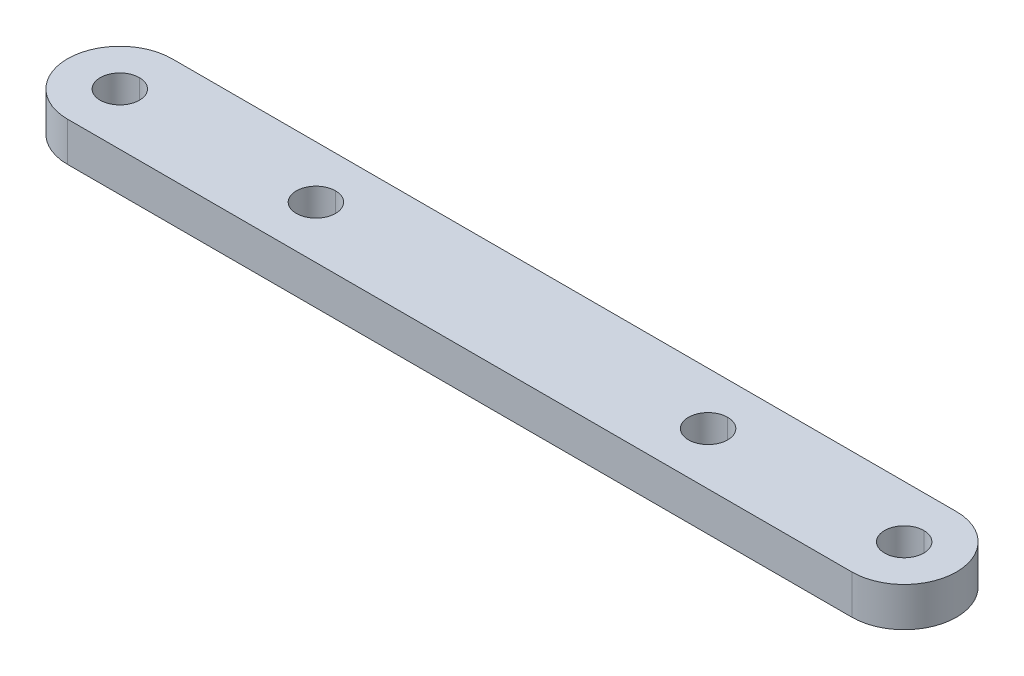
ISO-10303-21;
HEADER;
FILE_DESCRIPTION(('STEP AP214'),'2;1');
FILE_NAME('part.step','',(''),(''),'','','');
FILE_SCHEMA(('AUTOMOTIVE_DESIGN { 1 0 10303 214 1 1 1 1 }'));
ENDSEC;
DATA;
#1=APPLICATION_CONTEXT('core data for automotive mechanical design processes');
#2=APPLICATION_PROTOCOL_DEFINITION('international standard','automotive_design',2000,#1);
#3=PRODUCT_CONTEXT('',#1,'mechanical');
#4=PRODUCT('Part','Part','',(#3));
#5=PRODUCT_RELATED_PRODUCT_CATEGORY('part','',(#4));
#6=PRODUCT_DEFINITION_FORMATION('','',#4);
#7=PRODUCT_DEFINITION_CONTEXT('part definition',#1,'design');
#8=PRODUCT_DEFINITION('design','',#6,#7);
#9=PRODUCT_DEFINITION_SHAPE('','',#8);
#10=(LENGTH_UNIT() NAMED_UNIT(*) SI_UNIT(.MILLI.,.METRE.));
#11=(NAMED_UNIT(*) PLANE_ANGLE_UNIT() SI_UNIT($,.RADIAN.));
#12=(NAMED_UNIT(*) SI_UNIT($,.STERADIAN.) SOLID_ANGLE_UNIT());
#13=UNCERTAINTY_MEASURE_WITH_UNIT(LENGTH_MEASURE(1.E-05),#10,'distance_accuracy_value','');
#14=(GEOMETRIC_REPRESENTATION_CONTEXT(3) GLOBAL_UNCERTAINTY_ASSIGNED_CONTEXT((#13)) GLOBAL_UNIT_ASSIGNED_CONTEXT((#10,
#11,#12)) REPRESENTATION_CONTEXT('',''));
#15=CARTESIAN_POINT('',(0.,0.,0.));
#16=DIRECTION('',(0.,0.,1.));
#17=DIRECTION('',(1.,0.,0.));
#18=AXIS2_PLACEMENT_3D('',#15,#16,#17);
#19=CARTESIAN_POINT('',(-30.,-7.,0.));
#20=DIRECTION('',(0.,1.,0.));
#21=DIRECTION('',(0.,0.,1.));
#22=AXIS2_PLACEMENT_3D('',#19,#20,#21);
#23=CYLINDRICAL_SURFACE('',#22,1.5);
#24=DIRECTION('',(0.,1.,0.));
#25=VECTOR('',#24,1.);
#26=CARTESIAN_POINT('',(-30.,-7.,-1.5));
#27=LINE('',#26,#25);
#28=CARTESIAN_POINT('',(-30.,0.,-1.5));
#29=VERTEX_POINT('',#28);
#30=CARTESIAN_POINT('',(-30.,3.,-1.5));
#31=VERTEX_POINT('',#30);
#32=EDGE_CURVE('E141',#29,#31,#27,.T.);
#33=ORIENTED_EDGE('',*,*,#32,.F.);
#34=CARTESIAN_POINT('',(-30.,0.,0.));
#35=DIRECTION('',(0.,1.,0.));
#36=DIRECTION('',(0.,0.,1.));
#37=AXIS2_PLACEMENT_3D('',#34,#35,#36);
#38=CIRCLE('',#37,1.5);
#39=CARTESIAN_POINT('',(-30.,0.,1.5));
#40=VERTEX_POINT('',#39);
#41=EDGE_CURVE('E252',#40,#29,#38,.T.);
#42=ORIENTED_EDGE('',*,*,#41,.F.);
#43=DIRECTION('',(0.,1.,0.));
#44=VECTOR('',#43,1.);
#45=CARTESIAN_POINT('',(-30.,-7.,1.5));
#46=LINE('',#45,#44);
#47=CARTESIAN_POINT('',(-30.,3.,1.5));
#48=VERTEX_POINT('',#47);
#49=EDGE_CURVE('E144',#40,#48,#46,.T.);
#50=ORIENTED_EDGE('',*,*,#49,.T.);
#51=CARTESIAN_POINT('',(-30.,3.,0.));
#52=DIRECTION('',(0.,1.,0.));
#53=DIRECTION('',(0.,0.,1.));
#54=AXIS2_PLACEMENT_3D('',#51,#52,#53);
#55=CIRCLE('',#54,1.5);
#56=EDGE_CURVE('E138',#48,#31,#55,.T.);
#57=ORIENTED_EDGE('',*,*,#56,.T.);
#58=EDGE_LOOP('',(#33,#42,#50,#57));
#59=FACE_BOUND('',#58,.T.);
#60=ADVANCED_FACE('F16',(#59),#23,.F.);
#61=CARTESIAN_POINT('',(-15.,-7.,0.));
#62=DIRECTION('',(0.,1.,0.));
#63=DIRECTION('',(0.,0.,1.));
#64=AXIS2_PLACEMENT_3D('',#61,#62,#63);
#65=CYLINDRICAL_SURFACE('',#64,1.5);
#66=DIRECTION('',(0.,1.,0.));
#67=VECTOR('',#66,1.);
#68=CARTESIAN_POINT('',(-15.,-7.,-1.5));
#69=LINE('',#68,#67);
#70=CARTESIAN_POINT('',(-15.,0.,-1.5));
#71=VERTEX_POINT('',#70);
#72=CARTESIAN_POINT('',(-15.,3.,-1.5));
#73=VERTEX_POINT('',#72);
#74=EDGE_CURVE('E179',#71,#73,#69,.T.);
#75=ORIENTED_EDGE('',*,*,#74,.F.);
#76=CARTESIAN_POINT('',(-15.,0.,0.));
#77=DIRECTION('',(0.,1.,0.));
#78=DIRECTION('',(0.,0.,1.));
#79=AXIS2_PLACEMENT_3D('',#76,#77,#78);
#80=CIRCLE('',#79,1.5);
#81=CARTESIAN_POINT('',(-15.,0.,1.5));
#82=VERTEX_POINT('',#81);
#83=EDGE_CURVE('E264',#82,#71,#80,.T.);
#84=ORIENTED_EDGE('',*,*,#83,.F.);
#85=DIRECTION('',(0.,1.,0.));
#86=VECTOR('',#85,1.);
#87=CARTESIAN_POINT('',(-15.,-7.,1.5));
#88=LINE('',#87,#86);
#89=CARTESIAN_POINT('',(-15.,3.,1.5));
#90=VERTEX_POINT('',#89);
#91=EDGE_CURVE('E187',#82,#90,#88,.T.);
#92=ORIENTED_EDGE('',*,*,#91,.T.);
#93=CARTESIAN_POINT('',(-15.,3.,0.));
#94=DIRECTION('',(0.,1.,0.));
#95=DIRECTION('',(0.,0.,1.));
#96=AXIS2_PLACEMENT_3D('',#93,#94,#95);
#97=CIRCLE('',#96,1.5);
#98=EDGE_CURVE('E148',#90,#73,#97,.T.);
#99=ORIENTED_EDGE('',*,*,#98,.T.);
#100=EDGE_LOOP('',(#75,#84,#92,#99));
#101=FACE_BOUND('',#100,.T.);
#102=ADVANCED_FACE('F310',(#101),#65,.F.);
#103=CARTESIAN_POINT('',(15.,-7.,0.));
#104=DIRECTION('',(0.,1.,0.));
#105=DIRECTION('',(0.,0.,1.));
#106=AXIS2_PLACEMENT_3D('',#103,#104,#105);
#107=CYLINDRICAL_SURFACE('',#106,1.5);
#108=DIRECTION('',(0.,1.,0.));
#109=VECTOR('',#108,1.);
#110=CARTESIAN_POINT('',(15.,-7.,-1.5));
#111=LINE('',#110,#109);
#112=CARTESIAN_POINT('',(15.,0.,-1.5));
#113=VERTEX_POINT('',#112);
#114=CARTESIAN_POINT('',(15.,3.,-1.5));
#115=VERTEX_POINT('',#114);
#116=EDGE_CURVE('E202',#113,#115,#111,.T.);
#117=ORIENTED_EDGE('',*,*,#116,.F.);
#118=CARTESIAN_POINT('',(15.,0.,0.));
#119=DIRECTION('',(0.,1.,0.));
#120=DIRECTION('',(0.,0.,1.));
#121=AXIS2_PLACEMENT_3D('',#118,#119,#120);
#122=CIRCLE('',#121,1.5);
#123=CARTESIAN_POINT('',(15.,0.,1.5));
#124=VERTEX_POINT('',#123);
#125=EDGE_CURVE('E25',#124,#113,#122,.T.);
#126=ORIENTED_EDGE('',*,*,#125,.F.);
#127=DIRECTION('',(0.,1.,0.));
#128=VECTOR('',#127,1.);
#129=CARTESIAN_POINT('',(15.,-7.,1.5));
#130=LINE('',#129,#128);
#131=CARTESIAN_POINT('',(15.,3.,1.5));
#132=VERTEX_POINT('',#131);
#133=EDGE_CURVE('E188',#124,#132,#130,.T.);
#134=ORIENTED_EDGE('',*,*,#133,.T.);
#135=CARTESIAN_POINT('',(15.,3.,0.));
#136=DIRECTION('',(0.,1.,0.));
#137=DIRECTION('',(0.,0.,1.));
#138=AXIS2_PLACEMENT_3D('',#135,#136,#137);
#139=CIRCLE('',#138,1.5);
#140=EDGE_CURVE('E253',#132,#115,#139,.T.);
#141=ORIENTED_EDGE('',*,*,#140,.T.);
#142=EDGE_LOOP('',(#117,#126,#134,#141));
#143=FACE_BOUND('',#142,.T.);
#144=ADVANCED_FACE('F18',(#143),#107,.F.);
#145=CARTESIAN_POINT('',(30.,-7.,0.));
#146=DIRECTION('',(0.,1.,0.));
#147=DIRECTION('',(0.,0.,1.));
#148=AXIS2_PLACEMENT_3D('',#145,#146,#147);
#149=CYLINDRICAL_SURFACE('',#148,1.5);
#150=DIRECTION('',(0.,1.,0.));
#151=VECTOR('',#150,1.);
#152=CARTESIAN_POINT('',(30.,-7.,-1.5));
#153=LINE('',#152,#151);
#154=CARTESIAN_POINT('',(30.,0.,-1.5));
#155=VERTEX_POINT('',#154);
#156=CARTESIAN_POINT('',(30.,3.,-1.5));
#157=VERTEX_POINT('',#156);
#158=EDGE_CURVE('E201',#155,#157,#153,.T.);
#159=ORIENTED_EDGE('',*,*,#158,.F.);
#160=CARTESIAN_POINT('',(30.,0.,0.));
#161=DIRECTION('',(0.,1.,0.));
#162=DIRECTION('',(0.,0.,1.));
#163=AXIS2_PLACEMENT_3D('',#160,#161,#162);
#164=CIRCLE('',#163,1.5);
#165=CARTESIAN_POINT('',(30.,0.,1.5));
#166=VERTEX_POINT('',#165);
#167=EDGE_CURVE('E10',#166,#155,#164,.T.);
#168=ORIENTED_EDGE('',*,*,#167,.F.);
#169=DIRECTION('',(0.,1.,0.));
#170=VECTOR('',#169,1.);
#171=CARTESIAN_POINT('',(30.,-7.,1.5));
#172=LINE('',#171,#170);
#173=CARTESIAN_POINT('',(30.,3.,1.5));
#174=VERTEX_POINT('',#173);
#175=EDGE_CURVE('E168',#166,#174,#172,.T.);
#176=ORIENTED_EDGE('',*,*,#175,.T.);
#177=CARTESIAN_POINT('',(30.,3.,0.));
#178=DIRECTION('',(0.,1.,0.));
#179=DIRECTION('',(0.,0.,1.));
#180=AXIS2_PLACEMENT_3D('',#177,#178,#179);
#181=CIRCLE('',#180,1.5);
#182=EDGE_CURVE('E249',#174,#157,#181,.T.);
#183=ORIENTED_EDGE('',*,*,#182,.T.);
#184=EDGE_LOOP('',(#159,#168,#176,#183));
#185=FACE_BOUND('',#184,.T.);
#186=ADVANCED_FACE('F297',(#185),#149,.F.);
#187=CARTESIAN_POINT('',(-30.,0.,0.));
#188=DIRECTION('',(0.,1.,0.));
#189=DIRECTION('',(1.,0.,0.));
#190=AXIS2_PLACEMENT_3D('',#187,#188,#189);
#191=PLANE('',#190);
#192=ORIENTED_EDGE('',*,*,#167,.T.);
#193=CARTESIAN_POINT('',(30.,0.,0.));
#194=DIRECTION('',(0.,1.,0.));
#195=DIRECTION('',(0.,0.,1.));
#196=AXIS2_PLACEMENT_3D('',#193,#194,#195);
#197=CIRCLE('',#196,1.5);
#198=EDGE_CURVE('E192',#155,#166,#197,.T.);
#199=ORIENTED_EDGE('',*,*,#198,.T.);
#200=EDGE_LOOP('',(#192,#199));
#201=FACE_BOUND('',#200,.T.);
#202=ORIENTED_EDGE('',*,*,#125,.T.);
#203=CARTESIAN_POINT('',(15.,0.,0.));
#204=DIRECTION('',(0.,1.,0.));
#205=DIRECTION('',(0.,0.,1.));
#206=AXIS2_PLACEMENT_3D('',#203,#204,#205);
#207=CIRCLE('',#206,1.5);
#208=EDGE_CURVE('E197',#113,#124,#207,.T.);
#209=ORIENTED_EDGE('',*,*,#208,.T.);
#210=EDGE_LOOP('',(#202,#209));
#211=FACE_BOUND('',#210,.T.);
#212=ORIENTED_EDGE('',*,*,#83,.T.);
#213=CARTESIAN_POINT('',(-15.,0.,0.));
#214=DIRECTION('',(0.,1.,0.));
#215=DIRECTION('',(0.,0.,1.));
#216=AXIS2_PLACEMENT_3D('',#213,#214,#215);
#217=CIRCLE('',#216,1.5);
#218=EDGE_CURVE('E175',#71,#82,#217,.T.);
#219=ORIENTED_EDGE('',*,*,#218,.T.);
#220=EDGE_LOOP('',(#212,#219));
#221=FACE_BOUND('',#220,.T.);
#222=ORIENTED_EDGE('',*,*,#41,.T.);
#223=CARTESIAN_POINT('',(-30.,0.,0.));
#224=DIRECTION('',(0.,1.,0.));
#225=DIRECTION('',(0.,0.,1.));
#226=AXIS2_PLACEMENT_3D('',#223,#224,#225);
#227=CIRCLE('',#226,1.5);
#228=EDGE_CURVE('E158',#29,#40,#227,.T.);
#229=ORIENTED_EDGE('',*,*,#228,.T.);
#230=EDGE_LOOP('',(#222,#229));
#231=FACE_BOUND('',#230,.T.);
#232=CARTESIAN_POINT('',(-30.,0.,0.));
#233=DIRECTION('',(0.,1.,0.));
#234=DIRECTION('',(0.,0.,1.));
#235=AXIS2_PLACEMENT_3D('',#232,#233,#234);
#236=CIRCLE('',#235,4.);
#237=CARTESIAN_POINT('',(-30.,0.,-4.));
#238=VERTEX_POINT('',#237);
#239=CARTESIAN_POINT('',(-30.,0.,4.));
#240=VERTEX_POINT('',#239);
#241=EDGE_CURVE('E170',#238,#240,#236,.T.);
#242=ORIENTED_EDGE('',*,*,#241,.F.);
#243=DIRECTION('',(-1.,0.,0.));
#244=VECTOR('',#243,1.);
#245=CARTESIAN_POINT('',(-30.,0.,-4.));
#246=LINE('',#245,#244);
#247=CARTESIAN_POINT('',(30.,0.,-4.));
#248=VERTEX_POINT('',#247);
#249=EDGE_CURVE('E49',#248,#238,#246,.T.);
#250=ORIENTED_EDGE('',*,*,#249,.F.);
#251=CARTESIAN_POINT('',(30.,0.,0.));
#252=DIRECTION('',(0.,1.,0.));
#253=DIRECTION('',(0.,0.,1.));
#254=AXIS2_PLACEMENT_3D('',#251,#252,#253);
#255=CIRCLE('',#254,4.);
#256=CARTESIAN_POINT('',(30.,0.,4.));
#257=VERTEX_POINT('',#256);
#258=EDGE_CURVE('E239',#257,#248,#255,.T.);
#259=ORIENTED_EDGE('',*,*,#258,.F.);
#260=DIRECTION('',(1.,0.,0.));
#261=VECTOR('',#260,1.);
#262=CARTESIAN_POINT('',(-30.,0.,4.));
#263=LINE('',#262,#261);
#264=EDGE_CURVE('E211',#240,#257,#263,.T.);
#265=ORIENTED_EDGE('',*,*,#264,.F.);
#266=EDGE_LOOP('',(#242,#250,#259,#265));
#267=FACE_BOUND('',#266,.T.);
#268=ADVANCED_FACE('F272',(#201,#211,#221,#231,#267),#191,.F.);
#269=CARTESIAN_POINT('',(-30.,3.,0.));
#270=DIRECTION('',(0.,1.,0.));
#271=DIRECTION('',(1.,0.,0.));
#272=AXIS2_PLACEMENT_3D('',#269,#270,#271);
#273=PLANE('',#272);
#274=ORIENTED_EDGE('',*,*,#182,.F.);
#275=CARTESIAN_POINT('',(30.,3.,0.));
#276=DIRECTION('',(0.,1.,0.));
#277=DIRECTION('',(0.,0.,1.));
#278=AXIS2_PLACEMENT_3D('',#275,#276,#277);
#279=CIRCLE('',#278,1.5);
#280=EDGE_CURVE('E171',#157,#174,#279,.T.);
#281=ORIENTED_EDGE('',*,*,#280,.F.);
#282=EDGE_LOOP('',(#274,#281));
#283=FACE_BOUND('',#282,.T.);
#284=ORIENTED_EDGE('',*,*,#140,.F.);
#285=CARTESIAN_POINT('',(15.,3.,0.));
#286=DIRECTION('',(0.,1.,0.));
#287=DIRECTION('',(0.,0.,1.));
#288=AXIS2_PLACEMENT_3D('',#285,#286,#287);
#289=CIRCLE('',#288,1.5);
#290=EDGE_CURVE('E193',#115,#132,#289,.T.);
#291=ORIENTED_EDGE('',*,*,#290,.F.);
#292=EDGE_LOOP('',(#284,#291));
#293=FACE_BOUND('',#292,.T.);
#294=ORIENTED_EDGE('',*,*,#98,.F.);
#295=CARTESIAN_POINT('',(-15.,3.,0.));
#296=DIRECTION('',(0.,1.,0.));
#297=DIRECTION('',(0.,0.,1.));
#298=AXIS2_PLACEMENT_3D('',#295,#296,#297);
#299=CIRCLE('',#298,1.5);
#300=EDGE_CURVE('E183',#73,#90,#299,.T.);
#301=ORIENTED_EDGE('',*,*,#300,.F.);
#302=EDGE_LOOP('',(#294,#301));
#303=FACE_BOUND('',#302,.T.);
#304=ORIENTED_EDGE('',*,*,#56,.F.);
#305=CARTESIAN_POINT('',(-30.,3.,0.));
#306=DIRECTION('',(0.,1.,0.));
#307=DIRECTION('',(0.,0.,1.));
#308=AXIS2_PLACEMENT_3D('',#305,#306,#307);
#309=CIRCLE('',#308,1.5);
#310=EDGE_CURVE('E150',#31,#48,#309,.T.);
#311=ORIENTED_EDGE('',*,*,#310,.F.);
#312=EDGE_LOOP('',(#304,#311));
#313=FACE_BOUND('',#312,.T.);
#314=CARTESIAN_POINT('',(-30.,3.,0.));
#315=DIRECTION('',(0.,1.,0.));
#316=DIRECTION('',(0.,0.,1.));
#317=AXIS2_PLACEMENT_3D('',#314,#315,#316);
#318=CIRCLE('',#317,4.);
#319=CARTESIAN_POINT('',(-30.,3.,-4.));
#320=VERTEX_POINT('',#319);
#321=CARTESIAN_POINT('',(-30.,3.,4.));
#322=VERTEX_POINT('',#321);
#323=EDGE_CURVE('E225',#320,#322,#318,.T.);
#324=ORIENTED_EDGE('',*,*,#323,.T.);
#325=DIRECTION('',(1.,0.,0.));
#326=VECTOR('',#325,1.);
#327=CARTESIAN_POINT('',(-30.,3.,4.));
#328=LINE('',#327,#326);
#329=CARTESIAN_POINT('',(30.,3.,4.));
#330=VERTEX_POINT('',#329);
#331=EDGE_CURVE('E210',#322,#330,#328,.T.);
#332=ORIENTED_EDGE('',*,*,#331,.T.);
#333=CARTESIAN_POINT('',(30.,3.,0.));
#334=DIRECTION('',(0.,1.,0.));
#335=DIRECTION('',(0.,0.,1.));
#336=AXIS2_PLACEMENT_3D('',#333,#334,#335);
#337=CIRCLE('',#336,4.);
#338=CARTESIAN_POINT('',(30.,3.,-4.));
#339=VERTEX_POINT('',#338);
#340=EDGE_CURVE('E246',#330,#339,#337,.T.);
#341=ORIENTED_EDGE('',*,*,#340,.T.);
#342=DIRECTION('',(-1.,0.,0.));
#343=VECTOR('',#342,1.);
#344=CARTESIAN_POINT('',(-30.,3.,-4.));
#345=LINE('',#344,#343);
#346=EDGE_CURVE('E38',#339,#320,#345,.T.);
#347=ORIENTED_EDGE('',*,*,#346,.T.);
#348=EDGE_LOOP('',(#324,#332,#341,#347));
#349=FACE_BOUND('',#348,.T.);
#350=ADVANCED_FACE('F151',(#283,#293,#303,#313,#349),#273,.T.);
#351=CARTESIAN_POINT('',(-30.,3.,-4.));
#352=DIRECTION('',(0.,0.,1.));
#353=DIRECTION('',(1.,0.,0.));
#354=AXIS2_PLACEMENT_3D('',#351,#352,#353);
#355=PLANE('',#354);
#356=ORIENTED_EDGE('',*,*,#249,.T.);
#357=DIRECTION('',(0.,-1.,0.));
#358=VECTOR('',#357,1.);
#359=CARTESIAN_POINT('',(-30.,3.,-4.));
#360=LINE('',#359,#358);
#361=EDGE_CURVE('E229',#320,#238,#360,.T.);
#362=ORIENTED_EDGE('',*,*,#361,.F.);
#363=ORIENTED_EDGE('',*,*,#346,.F.);
#364=DIRECTION('',(0.,-1.,0.));
#365=VECTOR('',#364,1.);
#366=CARTESIAN_POINT('',(30.,3.,-4.));
#367=LINE('',#366,#365);
#368=EDGE_CURVE('E243',#339,#248,#367,.T.);
#369=ORIENTED_EDGE('',*,*,#368,.T.);
#370=EDGE_LOOP('',(#356,#362,#363,#369));
#371=FACE_BOUND('',#370,.T.);
#372=ADVANCED_FACE('F306',(#371),#355,.F.);
#373=CARTESIAN_POINT('',(30.,3.,0.));
#374=DIRECTION('',(0.,-1.,0.));
#375=DIRECTION('',(0.,0.,-1.));
#376=AXIS2_PLACEMENT_3D('',#373,#374,#375);
#377=CYLINDRICAL_SURFACE('',#376,4.);
#378=ORIENTED_EDGE('',*,*,#258,.T.);
#379=ORIENTED_EDGE('',*,*,#368,.F.);
#380=ORIENTED_EDGE('',*,*,#340,.F.);
#381=DIRECTION('',(0.,-1.,0.));
#382=VECTOR('',#381,1.);
#383=CARTESIAN_POINT('',(30.,3.,4.));
#384=LINE('',#383,#382);
#385=EDGE_CURVE('E206',#330,#257,#384,.T.);
#386=ORIENTED_EDGE('',*,*,#385,.T.);
#387=EDGE_LOOP('',(#378,#379,#380,#386));
#388=FACE_BOUND('',#387,.T.);
#389=ADVANCED_FACE('F328',(#388),#377,.T.);
#390=CARTESIAN_POINT('',(-30.,3.,4.));
#391=DIRECTION('',(0.,0.,-1.));
#392=DIRECTION('',(0.,-1.,0.));
#393=AXIS2_PLACEMENT_3D('',#390,#391,#392);
#394=PLANE('',#393);
#395=ORIENTED_EDGE('',*,*,#264,.T.);
#396=ORIENTED_EDGE('',*,*,#385,.F.);
#397=ORIENTED_EDGE('',*,*,#331,.F.);
#398=DIRECTION('',(0.,-1.,0.));
#399=VECTOR('',#398,1.);
#400=CARTESIAN_POINT('',(-30.,3.,4.));
#401=LINE('',#400,#399);
#402=EDGE_CURVE('E221',#322,#240,#401,.T.);
#403=ORIENTED_EDGE('',*,*,#402,.T.);
#404=EDGE_LOOP('',(#395,#396,#397,#403));
#405=FACE_BOUND('',#404,.T.);
#406=ADVANCED_FACE('F324',(#405),#394,.F.);
#407=CARTESIAN_POINT('',(-30.,3.,0.));
#408=DIRECTION('',(0.,-1.,0.));
#409=DIRECTION('',(0.,0.,-1.));
#410=AXIS2_PLACEMENT_3D('',#407,#408,#409);
#411=CYLINDRICAL_SURFACE('',#410,4.);
#412=ORIENTED_EDGE('',*,*,#241,.T.);
#413=ORIENTED_EDGE('',*,*,#402,.F.);
#414=ORIENTED_EDGE('',*,*,#323,.F.);
#415=ORIENTED_EDGE('',*,*,#361,.T.);
#416=EDGE_LOOP('',(#412,#413,#414,#415));
#417=FACE_BOUND('',#416,.T.);
#418=ADVANCED_FACE('F320',(#417),#411,.T.);
#419=CARTESIAN_POINT('',(30.,-7.,0.));
#420=DIRECTION('',(0.,1.,0.));
#421=DIRECTION('',(0.,0.,1.));
#422=AXIS2_PLACEMENT_3D('',#419,#420,#421);
#423=CYLINDRICAL_SURFACE('',#422,1.5);
#424=ORIENTED_EDGE('',*,*,#198,.F.);
#425=ORIENTED_EDGE('',*,*,#158,.T.);
#426=ORIENTED_EDGE('',*,*,#280,.T.);
#427=ORIENTED_EDGE('',*,*,#175,.F.);
#428=EDGE_LOOP('',(#424,#425,#426,#427));
#429=FACE_BOUND('',#428,.T.);
#430=ADVANCED_FACE('F292',(#429),#423,.F.);
#431=CARTESIAN_POINT('',(15.,-7.,0.));
#432=DIRECTION('',(0.,1.,0.));
#433=DIRECTION('',(0.,0.,1.));
#434=AXIS2_PLACEMENT_3D('',#431,#432,#433);
#435=CYLINDRICAL_SURFACE('',#434,1.5);
#436=ORIENTED_EDGE('',*,*,#208,.F.);
#437=ORIENTED_EDGE('',*,*,#116,.T.);
#438=ORIENTED_EDGE('',*,*,#290,.T.);
#439=ORIENTED_EDGE('',*,*,#133,.F.);
#440=EDGE_LOOP('',(#436,#437,#438,#439));
#441=FACE_BOUND('',#440,.T.);
#442=ADVANCED_FACE('F279',(#441),#435,.F.);
#443=CARTESIAN_POINT('',(-15.,-7.,0.));
#444=DIRECTION('',(0.,1.,0.));
#445=DIRECTION('',(0.,0.,1.));
#446=AXIS2_PLACEMENT_3D('',#443,#444,#445);
#447=CYLINDRICAL_SURFACE('',#446,1.5);
#448=ORIENTED_EDGE('',*,*,#218,.F.);
#449=ORIENTED_EDGE('',*,*,#74,.T.);
#450=ORIENTED_EDGE('',*,*,#300,.T.);
#451=ORIENTED_EDGE('',*,*,#91,.F.);
#452=EDGE_LOOP('',(#448,#449,#450,#451));
#453=FACE_BOUND('',#452,.T.);
#454=ADVANCED_FACE('F371',(#453),#447,.F.);
#455=CARTESIAN_POINT('',(-30.,-7.,0.));
#456=DIRECTION('',(0.,1.,0.));
#457=DIRECTION('',(0.,0.,1.));
#458=AXIS2_PLACEMENT_3D('',#455,#456,#457);
#459=CYLINDRICAL_SURFACE('',#458,1.5);
#460=ORIENTED_EDGE('',*,*,#228,.F.);
#461=ORIENTED_EDGE('',*,*,#32,.T.);
#462=ORIENTED_EDGE('',*,*,#310,.T.);
#463=ORIENTED_EDGE('',*,*,#49,.F.);
#464=EDGE_LOOP('',(#460,#461,#462,#463));
#465=FACE_BOUND('',#464,.T.);
#466=ADVANCED_FACE('F156',(#465),#459,.F.);
#467=CLOSED_SHELL('',(#60,#102,#144,#186,#268,#350,#372,#389,#406,#418,#430,#442,#454,#466));
#468=MANIFOLD_SOLID_BREP('B1',#467);
#469=ADVANCED_BREP_SHAPE_REPRESENTATION('',(#18,#468),#14);
#470=SHAPE_DEFINITION_REPRESENTATION(#9,#469);
ENDSEC;
END-ISO-10303-21;
